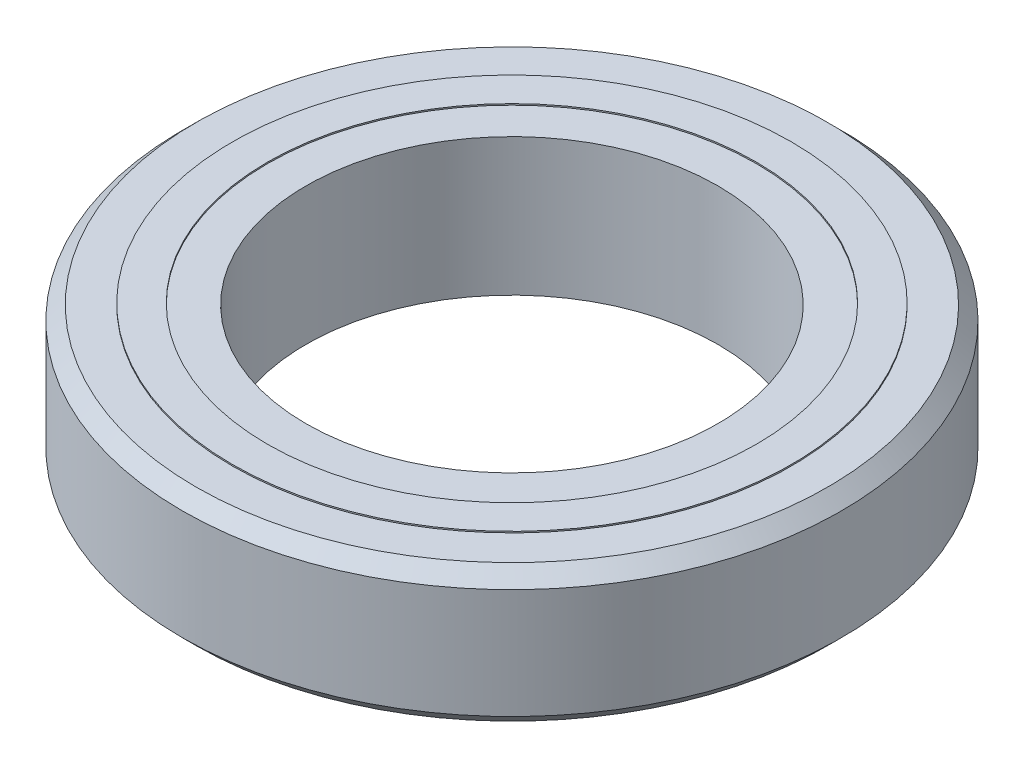
ISO-10303-21;
HEADER;
FILE_DESCRIPTION(('STEP AP214'),'2;1');
FILE_NAME('part.step','',(''),(''),'','','');
FILE_SCHEMA(('AUTOMOTIVE_DESIGN { 1 0 10303 214 1 1 1 1 }'));
ENDSEC;
DATA;
#1=APPLICATION_CONTEXT('core data for automotive mechanical design processes');
#2=APPLICATION_PROTOCOL_DEFINITION('international standard','automotive_design',2000,#1);
#3=PRODUCT_CONTEXT('',#1,'mechanical');
#4=PRODUCT('Part','Part','',(#3));
#5=PRODUCT_RELATED_PRODUCT_CATEGORY('part','',(#4));
#6=PRODUCT_DEFINITION_FORMATION('','',#4);
#7=PRODUCT_DEFINITION_CONTEXT('part definition',#1,'design');
#8=PRODUCT_DEFINITION('design','',#6,#7);
#9=PRODUCT_DEFINITION_SHAPE('','',#8);
#10=(LENGTH_UNIT() NAMED_UNIT(*) SI_UNIT(.MILLI.,.METRE.));
#11=(NAMED_UNIT(*) PLANE_ANGLE_UNIT() SI_UNIT($,.RADIAN.));
#12=(NAMED_UNIT(*) SI_UNIT($,.STERADIAN.) SOLID_ANGLE_UNIT());
#13=UNCERTAINTY_MEASURE_WITH_UNIT(LENGTH_MEASURE(1.E-05),#10,'distance_accuracy_value','');
#14=(GEOMETRIC_REPRESENTATION_CONTEXT(3) GLOBAL_UNCERTAINTY_ASSIGNED_CONTEXT((#13)) GLOBAL_UNIT_ASSIGNED_CONTEXT((#10,
#11,#12)) REPRESENTATION_CONTEXT('',''));
#15=CARTESIAN_POINT('',(0.,0.,0.));
#16=DIRECTION('',(0.,0.,1.));
#17=DIRECTION('',(1.,0.,0.));
#18=AXIS2_PLACEMENT_3D('',#15,#16,#17);
#19=CARTESIAN_POINT('',(0.,2.5,0.));
#20=DIRECTION('',(0.,1.,0.));
#21=DIRECTION('',(0.,0.,1.));
#22=AXIS2_PLACEMENT_3D('',#19,#20,#21);
#23=PLANE('',#22);
#24=CARTESIAN_POINT('',(0.,2.5,0.));
#25=DIRECTION('',(0.,1.,0.));
#26=DIRECTION('',(0.,0.,1.));
#27=AXIS2_PLACEMENT_3D('',#24,#25,#26);
#28=CIRCLE('',#27,10.1756320497532);
#29=CARTESIAN_POINT('',(0.,2.5,10.1756320497532));
#30=VERTEX_POINT('',#29);
#31=EDGE_CURVE('E52',#30,#30,#28,.F.);
#32=ORIENTED_EDGE('',*,*,#31,.T.);
#33=EDGE_LOOP('',(#32));
#34=FACE_BOUND('',#33,.T.);
#35=CARTESIAN_POINT('',(0.,2.5,0.));
#36=DIRECTION('',(0.,1.,0.));
#37=DIRECTION('',(0.,0.,1.));
#38=AXIS2_PLACEMENT_3D('',#35,#36,#37);
#39=CIRCLE('',#38,11.5);
#40=CARTESIAN_POINT('',(0.,2.5,11.5));
#41=VERTEX_POINT('',#40);
#42=EDGE_CURVE('E47',#41,#41,#39,.T.);
#43=ORIENTED_EDGE('',*,*,#42,.T.);
#44=EDGE_LOOP('',(#43));
#45=FACE_BOUND('',#44,.T.);
#46=ADVANCED_FACE('F35',(#34,#45),#23,.T.);
#47=CARTESIAN_POINT('',(0.,-2.5,0.));
#48=DIRECTION('',(0.,1.,0.));
#49=DIRECTION('',(0.,0.,1.));
#50=AXIS2_PLACEMENT_3D('',#47,#48,#49);
#51=PLANE('',#50);
#52=CARTESIAN_POINT('',(0.,-2.5,0.));
#53=DIRECTION('',(0.,1.,0.));
#54=DIRECTION('',(0.,0.,1.));
#55=AXIS2_PLACEMENT_3D('',#52,#53,#54);
#56=CIRCLE('',#55,10.1756320497532);
#57=CARTESIAN_POINT('',(0.,-2.5,10.1756320497532));
#58=VERTEX_POINT('',#57);
#59=EDGE_CURVE('E39',#58,#58,#56,.F.);
#60=ORIENTED_EDGE('',*,*,#59,.F.);
#61=EDGE_LOOP('',(#60));
#62=FACE_BOUND('',#61,.T.);
#63=CARTESIAN_POINT('',(0.,-2.5,0.));
#64=DIRECTION('',(0.,1.,0.));
#65=DIRECTION('',(0.,0.,1.));
#66=AXIS2_PLACEMENT_3D('',#63,#64,#65);
#67=CIRCLE('',#66,11.5);
#68=CARTESIAN_POINT('',(0.,-2.5,11.5));
#69=VERTEX_POINT('',#68);
#70=EDGE_CURVE('E68',#69,#69,#67,.F.);
#71=ORIENTED_EDGE('',*,*,#70,.T.);
#72=EDGE_LOOP('',(#71));
#73=FACE_BOUND('',#72,.T.);
#74=ADVANCED_FACE('F107',(#62,#73),#51,.F.);
#75=CARTESIAN_POINT('',(0.,2.5,0.));
#76=DIRECTION('',(0.,-1.,0.));
#77=DIRECTION('',(0.,0.,-1.));
#78=AXIS2_PLACEMENT_3D('',#75,#76,#77);
#79=CYLINDRICAL_SURFACE('',#78,12.);
#80=CARTESIAN_POINT('',(0.,-2.,0.));
#81=DIRECTION('',(0.,1.,0.));
#82=DIRECTION('',(0.,0.,1.));
#83=AXIS2_PLACEMENT_3D('',#80,#81,#82);
#84=CIRCLE('',#83,12.);
#85=CARTESIAN_POINT('',(0.,-2.,12.));
#86=VERTEX_POINT('',#85);
#87=EDGE_CURVE('E65',#86,#86,#84,.T.);
#88=ORIENTED_EDGE('',*,*,#87,.T.);
#89=EDGE_LOOP('',(#88));
#90=FACE_BOUND('',#89,.T.);
#91=CARTESIAN_POINT('',(0.,2.00000000000001,0.));
#92=DIRECTION('',(0.,1.,0.));
#93=DIRECTION('',(0.,0.,1.));
#94=AXIS2_PLACEMENT_3D('',#91,#92,#93);
#95=CIRCLE('',#94,12.);
#96=CARTESIAN_POINT('',(0.,2.00000000000001,12.));
#97=VERTEX_POINT('',#96);
#98=EDGE_CURVE('E60',#97,#97,#95,.F.);
#99=ORIENTED_EDGE('',*,*,#98,.T.);
#100=EDGE_LOOP('',(#99));
#101=FACE_BOUND('',#100,.T.);
#102=ADVANCED_FACE('F114',(#90,#101),#79,.T.);
#103=CARTESIAN_POINT('',(0.,-2.,0.));
#104=DIRECTION('',(0.,1.,0.));
#105=DIRECTION('',(0.,0.,1.));
#106=AXIS2_PLACEMENT_3D('',#103,#104,#105);
#107=CONICAL_SURFACE('',#106,12.,0.78539816339745);
#108=ORIENTED_EDGE('',*,*,#70,.F.);
#109=EDGE_LOOP('',(#108));
#110=FACE_BOUND('',#109,.T.);
#111=ORIENTED_EDGE('',*,*,#87,.F.);
#112=EDGE_LOOP('',(#111));
#113=FACE_BOUND('',#112,.T.);
#114=ADVANCED_FACE('F138',(#110,#113),#107,.T.);
#115=CARTESIAN_POINT('',(0.,2.5,0.));
#116=DIRECTION('',(0.,-1.,0.));
#117=DIRECTION('',(0.,0.,-1.));
#118=AXIS2_PLACEMENT_3D('',#115,#116,#117);
#119=CONICAL_SURFACE('',#118,11.5,0.785398163397448);
#120=ORIENTED_EDGE('',*,*,#98,.F.);
#121=EDGE_LOOP('',(#120));
#122=FACE_BOUND('',#121,.T.);
#123=ORIENTED_EDGE('',*,*,#42,.F.);
#124=EDGE_LOOP('',(#123));
#125=FACE_BOUND('',#124,.T.);
#126=ADVANCED_FACE('F37',(#122,#125),#119,.T.);
#127=CARTESIAN_POINT('',(0.,2.55,0.));
#128=DIRECTION('',(0.,-1.,0.));
#129=DIRECTION('',(0.,0.,-1.));
#130=AXIS2_PLACEMENT_3D('',#127,#128,#129);
#131=CYLINDRICAL_SURFACE('',#130,10.1756320497532);
#132=CARTESIAN_POINT('',(0.,-2.55,0.));
#133=DIRECTION('',(0.,1.,0.));
#134=DIRECTION('',(0.,0.,1.));
#135=AXIS2_PLACEMENT_3D('',#132,#133,#134);
#136=CIRCLE('',#135,10.1756320497532);
#137=CARTESIAN_POINT('',(0.,-2.55,10.1756320497532));
#138=VERTEX_POINT('',#137);
#139=EDGE_CURVE('E50',#138,#138,#136,.T.);
#140=ORIENTED_EDGE('',*,*,#139,.T.);
#141=EDGE_LOOP('',(#140));
#142=FACE_BOUND('',#141,.T.);
#143=ORIENTED_EDGE('',*,*,#59,.T.);
#144=EDGE_LOOP('',(#143));
#145=FACE_BOUND('',#144,.T.);
#146=ADVANCED_FACE('F101',(#142,#145),#131,.T.);
#147=CARTESIAN_POINT('',(0.,-2.55,0.));
#148=DIRECTION('',(0.,1.,0.));
#149=DIRECTION('',(0.,0.,1.));
#150=AXIS2_PLACEMENT_3D('',#147,#148,#149);
#151=PLANE('',#150);
#152=ORIENTED_EDGE('',*,*,#139,.F.);
#153=EDGE_LOOP('',(#152));
#154=FACE_BOUND('',#153,.T.);
#155=CARTESIAN_POINT('',(0.,-2.55,0.));
#156=DIRECTION('',(0.,1.,0.));
#157=DIRECTION('',(0.,0.,1.));
#158=AXIS2_PLACEMENT_3D('',#155,#156,#157);
#159=CIRCLE('',#158,8.90026343243335);
#160=CARTESIAN_POINT('',(0.,-2.55,8.90026343243335));
#161=VERTEX_POINT('',#160);
#162=EDGE_CURVE('E82',#161,#161,#159,.T.);
#163=ORIENTED_EDGE('',*,*,#162,.T.);
#164=EDGE_LOOP('',(#163));
#165=FACE_BOUND('',#164,.T.);
#166=ADVANCED_FACE('F102',(#154,#165),#151,.F.);
#167=CARTESIAN_POINT('',(0.,2.55,0.));
#168=DIRECTION('',(0.,-1.,0.));
#169=DIRECTION('',(0.,0.,-1.));
#170=AXIS2_PLACEMENT_3D('',#167,#168,#169);
#171=CYLINDRICAL_SURFACE('',#170,8.90026343243335);
#172=ORIENTED_EDGE('',*,*,#162,.F.);
#173=EDGE_LOOP('',(#172));
#174=FACE_BOUND('',#173,.T.);
#175=CARTESIAN_POINT('',(0.,-2.5,0.));
#176=DIRECTION('',(0.,1.,0.));
#177=DIRECTION('',(0.,0.,1.));
#178=AXIS2_PLACEMENT_3D('',#175,#176,#177);
#179=CIRCLE('',#178,8.90026343243335);
#180=CARTESIAN_POINT('',(0.,-2.5,8.90026343243335));
#181=VERTEX_POINT('',#180);
#182=EDGE_CURVE('E56',#181,#181,#179,.F.);
#183=ORIENTED_EDGE('',*,*,#182,.F.);
#184=EDGE_LOOP('',(#183));
#185=FACE_BOUND('',#184,.T.);
#186=ADVANCED_FACE('F93',(#174,#185),#171,.F.);
#187=CARTESIAN_POINT('',(0.,2.55,0.));
#188=DIRECTION('',(0.,1.,0.));
#189=DIRECTION('',(0.,0.,1.));
#190=AXIS2_PLACEMENT_3D('',#187,#188,#189);
#191=PLANE('',#190);
#192=CARTESIAN_POINT('',(0.,2.55,0.));
#193=DIRECTION('',(0.,1.,0.));
#194=DIRECTION('',(0.,0.,1.));
#195=AXIS2_PLACEMENT_3D('',#192,#193,#194);
#196=CIRCLE('',#195,10.1756320497532);
#197=CARTESIAN_POINT('',(0.,2.55,10.1756320497532));
#198=VERTEX_POINT('',#197);
#199=EDGE_CURVE('E73',#198,#198,#196,.T.);
#200=ORIENTED_EDGE('',*,*,#199,.T.);
#201=EDGE_LOOP('',(#200));
#202=FACE_BOUND('',#201,.T.);
#203=CARTESIAN_POINT('',(0.,2.55,0.));
#204=DIRECTION('',(0.,1.,0.));
#205=DIRECTION('',(0.,0.,1.));
#206=AXIS2_PLACEMENT_3D('',#203,#204,#205);
#207=CIRCLE('',#206,8.90026343243335);
#208=CARTESIAN_POINT('',(0.,2.55,8.90026343243335));
#209=VERTEX_POINT('',#208);
#210=EDGE_CURVE('E80',#209,#209,#207,.T.);
#211=ORIENTED_EDGE('',*,*,#210,.F.);
#212=EDGE_LOOP('',(#211));
#213=FACE_BOUND('',#212,.T.);
#214=ADVANCED_FACE('F90',(#202,#213),#191,.T.);
#215=ORIENTED_EDGE('',*,*,#31,.F.);
#216=EDGE_LOOP('',(#215));
#217=FACE_BOUND('',#216,.T.);
#218=ORIENTED_EDGE('',*,*,#199,.F.);
#219=EDGE_LOOP('',(#218));
#220=FACE_BOUND('',#219,.T.);
#221=ADVANCED_FACE('F92',(#217,#220),#131,.T.);
#222=CARTESIAN_POINT('',(0.,2.5,0.));
#223=DIRECTION('',(0.,1.,0.));
#224=DIRECTION('',(0.,0.,1.));
#225=AXIS2_PLACEMENT_3D('',#222,#223,#224);
#226=CIRCLE('',#225,8.90026343243335);
#227=CARTESIAN_POINT('',(0.,2.5,8.90026343243335));
#228=VERTEX_POINT('',#227);
#229=EDGE_CURVE('E10',#228,#228,#226,.F.);
#230=ORIENTED_EDGE('',*,*,#229,.T.);
#231=EDGE_LOOP('',(#230));
#232=FACE_BOUND('',#231,.T.);
#233=ORIENTED_EDGE('',*,*,#210,.T.);
#234=EDGE_LOOP('',(#233));
#235=FACE_BOUND('',#234,.T.);
#236=ADVANCED_FACE('F88',(#232,#235),#171,.F.);
#237=CARTESIAN_POINT('',(0.,2.5,0.));
#238=DIRECTION('',(0.,1.,0.));
#239=DIRECTION('',(0.,0.,1.));
#240=AXIS2_PLACEMENT_3D('',#237,#238,#239);
#241=CIRCLE('',#240,7.5);
#242=CARTESIAN_POINT('',(0.,2.5,7.5));
#243=VERTEX_POINT('',#242);
#244=EDGE_CURVE('E57',#243,#243,#241,.T.);
#245=ORIENTED_EDGE('',*,*,#244,.F.);
#246=EDGE_LOOP('',(#245));
#247=FACE_BOUND('',#246,.T.);
#248=ORIENTED_EDGE('',*,*,#229,.F.);
#249=EDGE_LOOP('',(#248));
#250=FACE_BOUND('',#249,.T.);
#251=ADVANCED_FACE('F110',(#247,#250),#23,.T.);
#252=CARTESIAN_POINT('',(0.,2.5,0.));
#253=DIRECTION('',(0.,-1.,0.));
#254=DIRECTION('',(0.,0.,-1.));
#255=AXIS2_PLACEMENT_3D('',#252,#253,#254);
#256=CYLINDRICAL_SURFACE('',#255,7.5);
#257=ORIENTED_EDGE('',*,*,#244,.T.);
#258=EDGE_LOOP('',(#257));
#259=FACE_BOUND('',#258,.T.);
#260=CARTESIAN_POINT('',(0.,-2.5,0.));
#261=DIRECTION('',(0.,1.,0.));
#262=DIRECTION('',(0.,0.,1.));
#263=AXIS2_PLACEMENT_3D('',#260,#261,#262);
#264=CIRCLE('',#263,7.5);
#265=CARTESIAN_POINT('',(0.,-2.5,7.5));
#266=VERTEX_POINT('',#265);
#267=EDGE_CURVE('E55',#266,#266,#264,.T.);
#268=ORIENTED_EDGE('',*,*,#267,.F.);
#269=EDGE_LOOP('',(#268));
#270=FACE_BOUND('',#269,.T.);
#271=ADVANCED_FACE('F121',(#259,#270),#256,.F.);
#272=ORIENTED_EDGE('',*,*,#267,.T.);
#273=EDGE_LOOP('',(#272));
#274=FACE_BOUND('',#273,.T.);
#275=ORIENTED_EDGE('',*,*,#182,.T.);
#276=EDGE_LOOP('',(#275));
#277=FACE_BOUND('',#276,.T.);
#278=ADVANCED_FACE('F117',(#274,#277),#51,.F.);
#279=CLOSED_SHELL('',(#46,#74,#102,#114,#126,#146,#166,#186,#214,#221,#236,#251,#271,#278));
#280=MANIFOLD_SOLID_BREP('B2',#279);
#281=ADVANCED_BREP_SHAPE_REPRESENTATION('',(#18,#280),#14);
#282=SHAPE_DEFINITION_REPRESENTATION(#9,#281);
ENDSEC;
END-ISO-10303-21;
